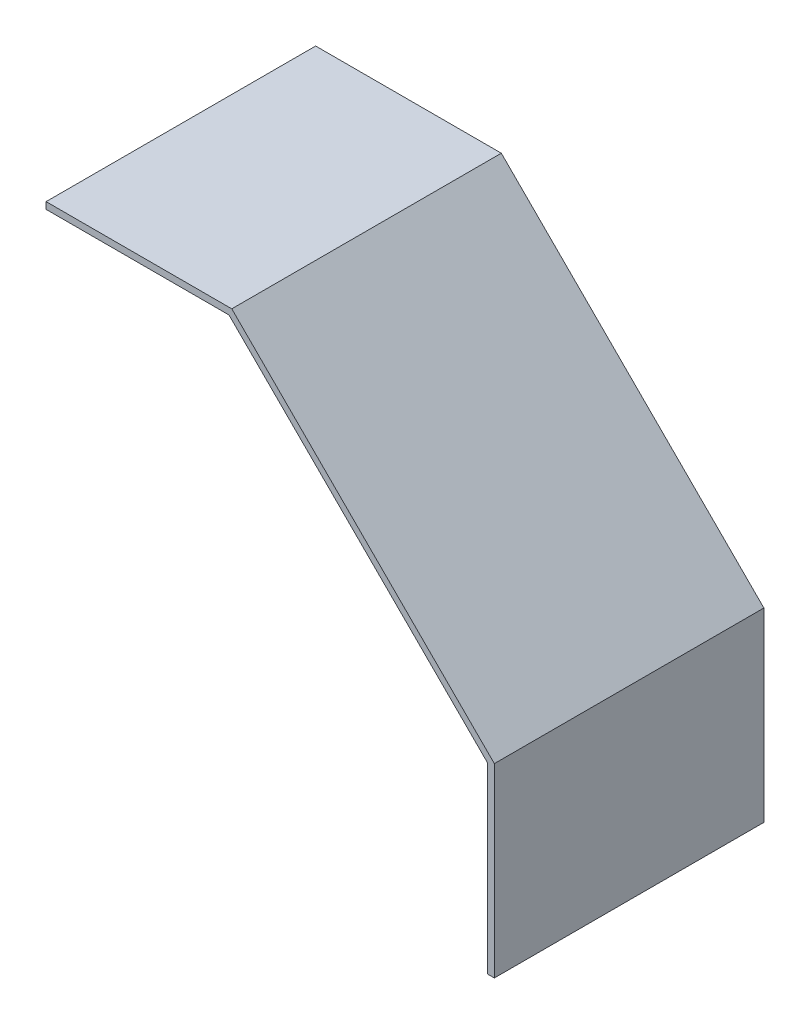
ISO-10303-21;
HEADER;
FILE_DESCRIPTION(('STEP AP214'),'2;1');
FILE_NAME('part.step','',(''),(''),'','','');
FILE_SCHEMA(('AUTOMOTIVE_DESIGN { 1 0 10303 214 1 1 1 1 }'));
ENDSEC;
DATA;
#1=APPLICATION_CONTEXT('core data for automotive mechanical design processes');
#2=APPLICATION_PROTOCOL_DEFINITION('international standard','automotive_design',2000,#1);
#3=PRODUCT_CONTEXT('',#1,'mechanical');
#4=PRODUCT('Part','Part','',(#3));
#5=PRODUCT_RELATED_PRODUCT_CATEGORY('part','',(#4));
#6=PRODUCT_DEFINITION_FORMATION('','',#4);
#7=PRODUCT_DEFINITION_CONTEXT('part definition',#1,'design');
#8=PRODUCT_DEFINITION('design','',#6,#7);
#9=PRODUCT_DEFINITION_SHAPE('','',#8);
#10=(LENGTH_UNIT() NAMED_UNIT(*) SI_UNIT(.MILLI.,.METRE.));
#11=(NAMED_UNIT(*) PLANE_ANGLE_UNIT() SI_UNIT($,.RADIAN.));
#12=(NAMED_UNIT(*) SI_UNIT($,.STERADIAN.) SOLID_ANGLE_UNIT());
#13=UNCERTAINTY_MEASURE_WITH_UNIT(LENGTH_MEASURE(1.E-05),#10,'distance_accuracy_value','');
#14=(GEOMETRIC_REPRESENTATION_CONTEXT(3) GLOBAL_UNCERTAINTY_ASSIGNED_CONTEXT((#13)) GLOBAL_UNIT_ASSIGNED_CONTEXT((#10,
#11,#12)) REPRESENTATION_CONTEXT('',''));
#15=CARTESIAN_POINT('',(0.,0.,0.));
#16=DIRECTION('',(0.,0.,1.));
#17=DIRECTION('',(1.,0.,0.));
#18=AXIS2_PLACEMENT_3D('',#15,#16,#17);
#19=CARTESIAN_POINT('',(416.04772226416,174.962865277319,254.));
#20=DIRECTION('',(1.,0.,0.));
#21=DIRECTION('',(0.,1.,0.));
#22=AXIS2_PLACEMENT_3D('',#19,#20,#21);
#23=PLANE('',#22);
#24=DIRECTION('',(0.,-1.,0.));
#25=VECTOR('',#24,1.);
#26=CARTESIAN_POINT('',(416.04772226416,174.962865277319,0.));
#27=LINE('',#26,#25);
#28=CARTESIAN_POINT('',(416.04772226416,172.33260915625,0.));
#29=VERTEX_POINT('',#28);
#30=CARTESIAN_POINT('',(416.04772226416,0.,0.));
#31=VERTEX_POINT('',#30);
#32=EDGE_CURVE('E136',#29,#31,#27,.T.);
#33=ORIENTED_EDGE('',*,*,#32,.T.);
#34=DIRECTION('',(0.,0.,-1.));
#35=VECTOR('',#34,1.);
#36=CARTESIAN_POINT('',(416.04772226416,0.,254.));
#37=LINE('',#36,#35);
#38=CARTESIAN_POINT('',(416.04772226416,0.,254.));
#39=VERTEX_POINT('',#38);
#40=EDGE_CURVE('E11',#39,#31,#37,.T.);
#41=ORIENTED_EDGE('',*,*,#40,.F.);
#42=DIRECTION('',(0.,-1.,0.));
#43=VECTOR('',#42,1.);
#44=CARTESIAN_POINT('',(416.04772226416,174.962865277319,254.));
#45=LINE('',#44,#43);
#46=CARTESIAN_POINT('',(416.04772226416,172.33260915625,254.));
#47=VERTEX_POINT('',#46);
#48=EDGE_CURVE('E94',#47,#39,#45,.T.);
#49=ORIENTED_EDGE('',*,*,#48,.F.);
#50=DIRECTION('',(0.,0.,-1.));
#51=VECTOR('',#50,1.);
#52=CARTESIAN_POINT('',(416.04772226416,172.33260915625,254.));
#53=LINE('',#52,#51);
#54=EDGE_CURVE('E135',#47,#29,#53,.T.);
#55=ORIENTED_EDGE('',*,*,#54,.T.);
#56=EDGE_LOOP('',(#33,#41,#49,#55));
#57=FACE_BOUND('',#56,.T.);
#58=ADVANCED_FACE('F39',(#57),#23,.F.);
#59=CARTESIAN_POINT('',(422.39772226416,0.,254.));
#60=DIRECTION('',(0.,-1.,0.));
#61=DIRECTION('',(1.,0.,0.));
#62=AXIS2_PLACEMENT_3D('',#59,#60,#61);
#63=PLANE('',#62);
#64=DIRECTION('',(-1.,0.,0.));
#65=VECTOR('',#64,1.);
#66=CARTESIAN_POINT('',(422.39772226416,0.,0.));
#67=LINE('',#66,#65);
#68=CARTESIAN_POINT('',(422.39772226416,0.,0.));
#69=VERTEX_POINT('',#68);
#70=EDGE_CURVE('E139',#69,#31,#67,.T.);
#71=ORIENTED_EDGE('',*,*,#70,.F.);
#72=DIRECTION('',(0.,0.,-1.));
#73=VECTOR('',#72,1.);
#74=CARTESIAN_POINT('',(422.39772226416,0.,254.));
#75=LINE('',#74,#73);
#76=CARTESIAN_POINT('',(422.39772226416,0.,254.));
#77=VERTEX_POINT('',#76);
#78=EDGE_CURVE('E47',#77,#69,#75,.T.);
#79=ORIENTED_EDGE('',*,*,#78,.F.);
#80=DIRECTION('',(-1.,0.,0.));
#81=VECTOR('',#80,1.);
#82=CARTESIAN_POINT('',(422.39772226416,0.,254.));
#83=LINE('',#82,#81);
#84=EDGE_CURVE('E178',#77,#39,#83,.T.);
#85=ORIENTED_EDGE('',*,*,#84,.T.);
#86=ORIENTED_EDGE('',*,*,#40,.T.);
#87=EDGE_LOOP('',(#71,#79,#85,#86));
#88=FACE_BOUND('',#87,.T.);
#89=ADVANCED_FACE('F169',(#88),#63,.T.);
#90=CARTESIAN_POINT('',(422.397722264161,174.962865277319,254.));
#91=DIRECTION('',(1.,0.,0.));
#92=DIRECTION('',(0.,1.,0.));
#93=AXIS2_PLACEMENT_3D('',#90,#91,#92);
#94=PLANE('',#93);
#95=DIRECTION('',(0.,-1.,0.));
#96=VECTOR('',#95,1.);
#97=CARTESIAN_POINT('',(422.397722264161,174.962865277319,0.));
#98=LINE('',#97,#96);
#99=CARTESIAN_POINT('',(422.397722264161,174.962865277319,0.));
#100=VERTEX_POINT('',#99);
#101=EDGE_CURVE('E142',#100,#69,#98,.T.);
#102=ORIENTED_EDGE('',*,*,#101,.F.);
#103=DIRECTION('',(0.,0.,-1.));
#104=VECTOR('',#103,1.);
#105=CARTESIAN_POINT('',(422.397722264161,174.962865277319,254.));
#106=LINE('',#105,#104);
#107=CARTESIAN_POINT('',(422.397722264161,174.962865277319,254.));
#108=VERTEX_POINT('',#107);
#109=EDGE_CURVE('E159',#108,#100,#106,.T.);
#110=ORIENTED_EDGE('',*,*,#109,.F.);
#111=DIRECTION('',(0.,-1.,0.));
#112=VECTOR('',#111,1.);
#113=CARTESIAN_POINT('',(422.397722264161,174.962865277319,254.));
#114=LINE('',#113,#112);
#115=EDGE_CURVE('E166',#108,#77,#114,.T.);
#116=ORIENTED_EDGE('',*,*,#115,.T.);
#117=ORIENTED_EDGE('',*,*,#78,.T.);
#118=EDGE_LOOP('',(#102,#110,#116,#117));
#119=FACE_BOUND('',#118,.T.);
#120=ADVANCED_FACE('F164',(#119),#94,.T.);
#121=CARTESIAN_POINT('',(174.962865277319,422.39772226416,254.));
#122=DIRECTION('',(0.707106781186548,0.707106781186547,0.));
#123=DIRECTION('',(-0.707106781186547,0.707106781186548,0.));
#124=AXIS2_PLACEMENT_3D('',#121,#122,#123);
#125=PLANE('',#124);
#126=DIRECTION('',(0.707106781186547,-0.707106781186548,0.));
#127=VECTOR('',#126,1.);
#128=CARTESIAN_POINT('',(174.962865277319,422.39772226416,0.));
#129=LINE('',#128,#127);
#130=CARTESIAN_POINT('',(174.962865277319,422.39772226416,0.));
#131=VERTEX_POINT('',#130);
#132=EDGE_CURVE('E145',#131,#100,#129,.T.);
#133=ORIENTED_EDGE('',*,*,#132,.F.);
#134=DIRECTION('',(0.,0.,-1.));
#135=VECTOR('',#134,1.);
#136=CARTESIAN_POINT('',(174.962865277319,422.39772226416,254.));
#137=LINE('',#136,#135);
#138=CARTESIAN_POINT('',(174.962865277319,422.39772226416,254.));
#139=VERTEX_POINT('',#138);
#140=EDGE_CURVE('E157',#139,#131,#137,.T.);
#141=ORIENTED_EDGE('',*,*,#140,.F.);
#142=DIRECTION('',(0.707106781186547,-0.707106781186548,0.));
#143=VECTOR('',#142,1.);
#144=CARTESIAN_POINT('',(174.962865277319,422.39772226416,254.));
#145=LINE('',#144,#143);
#146=EDGE_CURVE('E130',#139,#108,#145,.T.);
#147=ORIENTED_EDGE('',*,*,#146,.T.);
#148=ORIENTED_EDGE('',*,*,#109,.T.);
#149=EDGE_LOOP('',(#133,#141,#147,#148));
#150=FACE_BOUND('',#149,.T.);
#151=ADVANCED_FACE('F176',(#150),#125,.T.);
#152=CARTESIAN_POINT('',(0.,422.39772226416,254.));
#153=DIRECTION('',(0.,1.,0.));
#154=DIRECTION('',(-1.,0.,0.));
#155=AXIS2_PLACEMENT_3D('',#152,#153,#154);
#156=PLANE('',#155);
#157=DIRECTION('',(1.,0.,0.));
#158=VECTOR('',#157,1.);
#159=CARTESIAN_POINT('',(0.,422.39772226416,0.));
#160=LINE('',#159,#158);
#161=CARTESIAN_POINT('',(0.,422.39772226416,0.));
#162=VERTEX_POINT('',#161);
#163=EDGE_CURVE('E148',#162,#131,#160,.T.);
#164=ORIENTED_EDGE('',*,*,#163,.F.);
#165=DIRECTION('',(0.,0.,-1.));
#166=VECTOR('',#165,1.);
#167=CARTESIAN_POINT('',(0.,422.39772226416,254.));
#168=LINE('',#167,#166);
#169=CARTESIAN_POINT('',(0.,422.39772226416,254.));
#170=VERTEX_POINT('',#169);
#171=EDGE_CURVE('E118',#170,#162,#168,.T.);
#172=ORIENTED_EDGE('',*,*,#171,.F.);
#173=DIRECTION('',(1.,0.,0.));
#174=VECTOR('',#173,1.);
#175=CARTESIAN_POINT('',(0.,422.39772226416,254.));
#176=LINE('',#175,#174);
#177=EDGE_CURVE('E128',#170,#139,#176,.T.);
#178=ORIENTED_EDGE('',*,*,#177,.T.);
#179=ORIENTED_EDGE('',*,*,#140,.T.);
#180=EDGE_LOOP('',(#164,#172,#178,#179));
#181=FACE_BOUND('',#180,.T.);
#182=ADVANCED_FACE('F183',(#181),#156,.T.);
#183=CARTESIAN_POINT('',(0.,416.04772226416,254.));
#184=DIRECTION('',(-1.,0.,0.));
#185=DIRECTION('',(0.,-1.,0.));
#186=AXIS2_PLACEMENT_3D('',#183,#184,#185);
#187=PLANE('',#186);
#188=DIRECTION('',(0.,1.,0.));
#189=VECTOR('',#188,1.);
#190=CARTESIAN_POINT('',(0.,416.04772226416,0.));
#191=LINE('',#190,#189);
#192=CARTESIAN_POINT('',(0.,416.04772226416,0.));
#193=VERTEX_POINT('',#192);
#194=EDGE_CURVE('E117',#193,#162,#191,.T.);
#195=ORIENTED_EDGE('',*,*,#194,.F.);
#196=DIRECTION('',(0.,0.,-1.));
#197=VECTOR('',#196,1.);
#198=CARTESIAN_POINT('',(0.,416.04772226416,254.));
#199=LINE('',#198,#197);
#200=CARTESIAN_POINT('',(0.,416.04772226416,254.));
#201=VERTEX_POINT('',#200);
#202=EDGE_CURVE('E111',#201,#193,#199,.T.);
#203=ORIENTED_EDGE('',*,*,#202,.F.);
#204=DIRECTION('',(0.,1.,0.));
#205=VECTOR('',#204,1.);
#206=CARTESIAN_POINT('',(0.,416.04772226416,254.));
#207=LINE('',#206,#205);
#208=EDGE_CURVE('E115',#201,#170,#207,.T.);
#209=ORIENTED_EDGE('',*,*,#208,.T.);
#210=ORIENTED_EDGE('',*,*,#171,.T.);
#211=EDGE_LOOP('',(#195,#203,#209,#210));
#212=FACE_BOUND('',#211,.T.);
#213=ADVANCED_FACE('F113',(#212),#187,.T.);
#214=CARTESIAN_POINT('',(0.,416.04772226416,254.));
#215=DIRECTION('',(0.,1.,0.));
#216=DIRECTION('',(-1.,0.,0.));
#217=AXIS2_PLACEMENT_3D('',#214,#215,#216);
#218=PLANE('',#217);
#219=DIRECTION('',(1.,0.,0.));
#220=VECTOR('',#219,1.);
#221=CARTESIAN_POINT('',(0.,416.04772226416,0.));
#222=LINE('',#221,#220);
#223=CARTESIAN_POINT('',(172.33260915625,416.04772226416,0.));
#224=VERTEX_POINT('',#223);
#225=EDGE_CURVE('E82',#193,#224,#222,.T.);
#226=ORIENTED_EDGE('',*,*,#225,.T.);
#227=DIRECTION('',(0.,0.,-1.));
#228=VECTOR('',#227,1.);
#229=CARTESIAN_POINT('',(172.33260915625,416.04772226416,254.));
#230=LINE('',#229,#228);
#231=CARTESIAN_POINT('',(172.33260915625,416.04772226416,254.));
#232=VERTEX_POINT('',#231);
#233=EDGE_CURVE('E119',#232,#224,#230,.T.);
#234=ORIENTED_EDGE('',*,*,#233,.F.);
#235=DIRECTION('',(1.,0.,0.));
#236=VECTOR('',#235,1.);
#237=CARTESIAN_POINT('',(0.,416.04772226416,254.));
#238=LINE('',#237,#236);
#239=EDGE_CURVE('E121',#201,#232,#238,.T.);
#240=ORIENTED_EDGE('',*,*,#239,.F.);
#241=ORIENTED_EDGE('',*,*,#202,.T.);
#242=EDGE_LOOP('',(#226,#234,#240,#241));
#243=FACE_BOUND('',#242,.T.);
#244=ADVANCED_FACE('F122',(#243),#218,.F.);
#245=CARTESIAN_POINT('',(170.472737216785,417.907594203626,254.));
#246=DIRECTION('',(0.707106781186548,0.707106781186547,0.));
#247=DIRECTION('',(-0.707106781186547,0.707106781186548,0.));
#248=AXIS2_PLACEMENT_3D('',#245,#246,#247);
#249=PLANE('',#248);
#250=DIRECTION('',(0.707106781186547,-0.707106781186548,0.));
#251=VECTOR('',#250,1.);
#252=CARTESIAN_POINT('',(170.472737216785,417.907594203626,0.));
#253=LINE('',#252,#251);
#254=EDGE_CURVE('E88',#224,#29,#253,.T.);
#255=ORIENTED_EDGE('',*,*,#254,.T.);
#256=ORIENTED_EDGE('',*,*,#54,.F.);
#257=DIRECTION('',(0.707106781186547,-0.707106781186548,0.));
#258=VECTOR('',#257,1.);
#259=CARTESIAN_POINT('',(170.472737216785,417.907594203626,254.));
#260=LINE('',#259,#258);
#261=EDGE_CURVE('E55',#232,#47,#260,.T.);
#262=ORIENTED_EDGE('',*,*,#261,.F.);
#263=ORIENTED_EDGE('',*,*,#233,.T.);
#264=EDGE_LOOP('',(#255,#256,#262,#263));
#265=FACE_BOUND('',#264,.T.);
#266=ADVANCED_FACE('F185',(#265),#249,.F.);
#267=CARTESIAN_POINT('',(0.,0.,254.));
#268=DIRECTION('',(0.,0.,-1.));
#269=DIRECTION('',(-1.,0.,0.));
#270=AXIS2_PLACEMENT_3D('',#267,#268,#269);
#271=PLANE('',#270);
#272=ORIENTED_EDGE('',*,*,#48,.T.);
#273=ORIENTED_EDGE('',*,*,#84,.F.);
#274=ORIENTED_EDGE('',*,*,#115,.F.);
#275=ORIENTED_EDGE('',*,*,#146,.F.);
#276=ORIENTED_EDGE('',*,*,#177,.F.);
#277=ORIENTED_EDGE('',*,*,#208,.F.);
#278=ORIENTED_EDGE('',*,*,#239,.T.);
#279=ORIENTED_EDGE('',*,*,#261,.T.);
#280=EDGE_LOOP('',(#272,#273,#274,#275,#276,#277,#278,#279));
#281=FACE_BOUND('',#280,.T.);
#282=ADVANCED_FACE('F125',(#281),#271,.F.);
#283=CARTESIAN_POINT('',(0.,0.,0.));
#284=DIRECTION('',(0.,0.,-1.));
#285=DIRECTION('',(-1.,0.,0.));
#286=AXIS2_PLACEMENT_3D('',#283,#284,#285);
#287=PLANE('',#286);
#288=ORIENTED_EDGE('',*,*,#32,.F.);
#289=ORIENTED_EDGE('',*,*,#254,.F.);
#290=ORIENTED_EDGE('',*,*,#225,.F.);
#291=ORIENTED_EDGE('',*,*,#194,.T.);
#292=ORIENTED_EDGE('',*,*,#163,.T.);
#293=ORIENTED_EDGE('',*,*,#132,.T.);
#294=ORIENTED_EDGE('',*,*,#101,.T.);
#295=ORIENTED_EDGE('',*,*,#70,.T.);
#296=EDGE_LOOP('',(#288,#289,#290,#291,#292,#293,#294,#295));
#297=FACE_BOUND('',#296,.T.);
#298=ADVANCED_FACE('F172',(#297),#287,.T.);
#299=CLOSED_SHELL('',(#58,#89,#120,#151,#182,#213,#244,#266,#282,#298));
#300=MANIFOLD_SOLID_BREP('B2',#299);
#301=ADVANCED_BREP_SHAPE_REPRESENTATION('',(#18,#300),#14);
#302=SHAPE_DEFINITION_REPRESENTATION(#9,#301);
ENDSEC;
END-ISO-10303-21;
